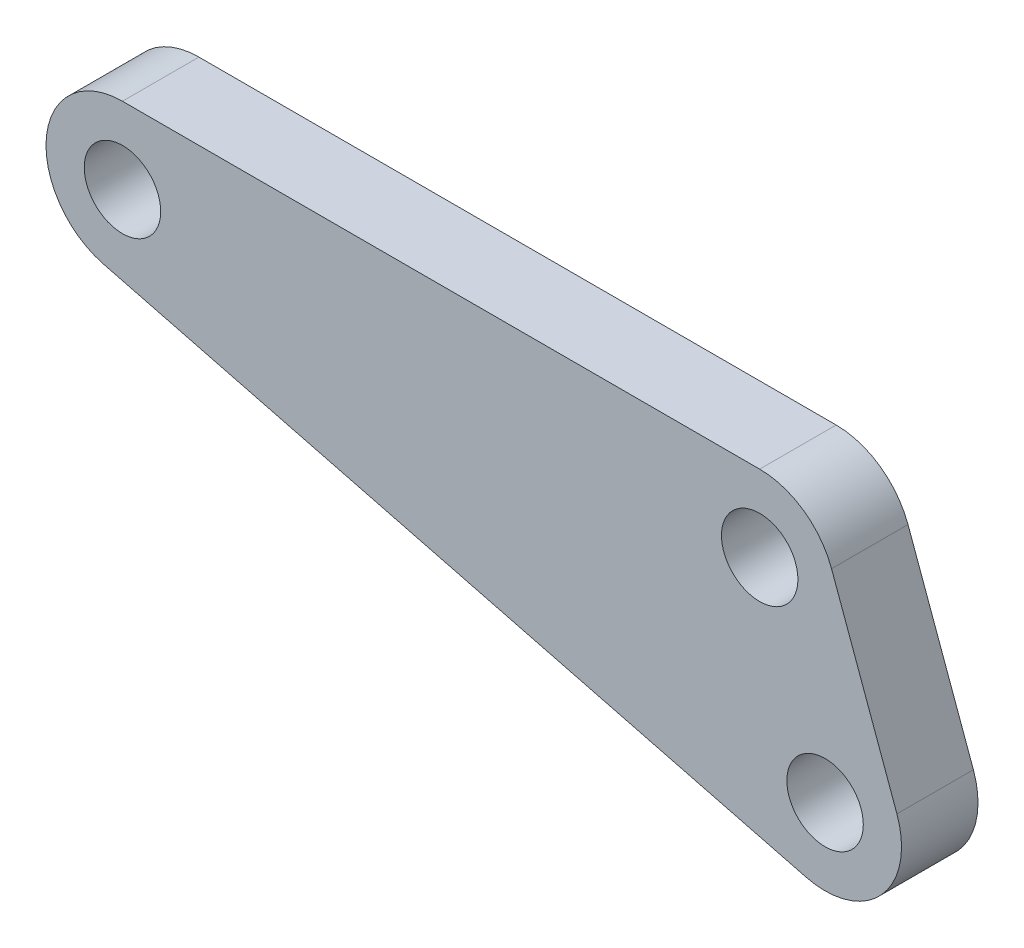
ISO-10303-21;
HEADER;
FILE_DESCRIPTION(('STEP AP214'),'2;1');
FILE_NAME('part.step','',(''),(''),'','','');
FILE_SCHEMA(('AUTOMOTIVE_DESIGN { 1 0 10303 214 1 1 1 1 }'));
ENDSEC;
DATA;
#1=APPLICATION_CONTEXT('core data for automotive mechanical design processes');
#2=APPLICATION_PROTOCOL_DEFINITION('international standard','automotive_design',2000,#1);
#3=PRODUCT_CONTEXT('',#1,'mechanical');
#4=PRODUCT('Part','Part','',(#3));
#5=PRODUCT_RELATED_PRODUCT_CATEGORY('part','',(#4));
#6=PRODUCT_DEFINITION_FORMATION('','',#4);
#7=PRODUCT_DEFINITION_CONTEXT('part definition',#1,'design');
#8=PRODUCT_DEFINITION('design','',#6,#7);
#9=PRODUCT_DEFINITION_SHAPE('','',#8);
#10=(LENGTH_UNIT() NAMED_UNIT(*) SI_UNIT(.MILLI.,.METRE.));
#11=(NAMED_UNIT(*) PLANE_ANGLE_UNIT() SI_UNIT($,.RADIAN.));
#12=(NAMED_UNIT(*) SI_UNIT($,.STERADIAN.) SOLID_ANGLE_UNIT());
#13=UNCERTAINTY_MEASURE_WITH_UNIT(LENGTH_MEASURE(1.E-05),#10,'distance_accuracy_value','');
#14=(GEOMETRIC_REPRESENTATION_CONTEXT(3) GLOBAL_UNCERTAINTY_ASSIGNED_CONTEXT((#13)) GLOBAL_UNIT_ASSIGNED_CONTEXT((#10,
#11,#12)) REPRESENTATION_CONTEXT('',''));
#15=CARTESIAN_POINT('',(0.,0.,0.));
#16=DIRECTION('',(0.,0.,1.));
#17=DIRECTION('',(1.,0.,0.));
#18=AXIS2_PLACEMENT_3D('',#15,#16,#17);
#19=CARTESIAN_POINT('',(0.,0.,3.));
#20=DIRECTION('',(0.,0.,1.));
#21=DIRECTION('',(1.,0.,0.));
#22=AXIS2_PLACEMENT_3D('',#19,#20,#21);
#23=PLANE('',#22);
#24=CARTESIAN_POINT('',(0.,0.,3.));
#25=DIRECTION('',(0.,0.,1.));
#26=DIRECTION('',(1.,0.,0.));
#27=AXIS2_PLACEMENT_3D('',#24,#25,#26);
#28=CIRCLE('',#27,1.5);
#29=CARTESIAN_POINT('',(1.5,0.,3.));
#30=VERTEX_POINT('',#29);
#31=EDGE_CURVE('E207',#30,#30,#28,.T.);
#32=ORIENTED_EDGE('',*,*,#31,.F.);
#33=EDGE_LOOP('',(#32));
#34=FACE_BOUND('',#33,.T.);
#35=CARTESIAN_POINT('',(0.,0.,3.));
#36=DIRECTION('',(0.,0.,1.));
#37=DIRECTION('',(1.,0.,0.));
#38=AXIS2_PLACEMENT_3D('',#35,#36,#37);
#39=CIRCLE('',#38,3.);
#40=CARTESIAN_POINT('',(2.81907786235772,1.02606042997702,3.));
#41=VERTEX_POINT('',#40);
#42=CARTESIAN_POINT('',(0.,3.,3.));
#43=VERTEX_POINT('',#42);
#44=EDGE_CURVE('E146',#41,#43,#39,.T.);
#45=ORIENTED_EDGE('',*,*,#44,.T.);
#46=DIRECTION('',(-1.,0.,0.));
#47=VECTOR('',#46,1.);
#48=CARTESIAN_POINT('',(-25.,3.,3.));
#49=LINE('',#48,#47);
#50=CARTESIAN_POINT('',(-25.,3.,3.));
#51=VERTEX_POINT('',#50);
#52=EDGE_CURVE('E94',#43,#51,#49,.T.);
#53=ORIENTED_EDGE('',*,*,#52,.T.);
#54=CARTESIAN_POINT('',(-25.,0.,3.));
#55=DIRECTION('',(0.,0.,1.));
#56=DIRECTION('',(1.,0.,0.));
#57=AXIS2_PLACEMENT_3D('',#54,#55,#56);
#58=CIRCLE('',#57,3.);
#59=CARTESIAN_POINT('',(-25.7431181723219,-2.90650569962713,3.));
#60=VERTEX_POINT('',#59);
#61=EDGE_CURVE('E107',#51,#60,#58,.T.);
#62=ORIENTED_EDGE('',*,*,#61,.T.);
#63=DIRECTION('',(0.968835233209041,-0.247706057440634,0.));
#64=VECTOR('',#63,1.);
#65=CARTESIAN_POINT('',(1.82203290262064,-9.95420035552143,3.));
#66=LINE('',#65,#64);
#67=CARTESIAN_POINT('',(1.82203290262064,-9.95420035552143,3.));
#68=VERTEX_POINT('',#67);
#69=EDGE_CURVE('E101',#60,#68,#66,.T.);
#70=ORIENTED_EDGE('',*,*,#69,.T.);
#71=CARTESIAN_POINT('',(2.56515107494255,-7.0476946558943,3.));
#72=DIRECTION('',(0.,0.,1.));
#73=DIRECTION('',(1.,0.,0.));
#74=AXIS2_PLACEMENT_3D('',#71,#72,#73);
#75=CIRCLE('',#74,3.);
#76=CARTESIAN_POINT('',(5.38422893730027,-6.02163422591728,3.));
#77=VERTEX_POINT('',#76);
#78=EDGE_CURVE('E105',#68,#77,#75,.T.);
#79=ORIENTED_EDGE('',*,*,#78,.T.);
#80=DIRECTION('',(-0.342020143325673,0.939692620785907,0.));
#81=VECTOR('',#80,1.);
#82=CARTESIAN_POINT('',(2.81907786235772,1.02606042997702,3.));
#83=LINE('',#82,#81);
#84=EDGE_CURVE('E57',#77,#41,#83,.T.);
#85=ORIENTED_EDGE('',*,*,#84,.T.);
#86=EDGE_LOOP('',(#45,#53,#62,#70,#79,#85));
#87=FACE_BOUND('',#86,.T.);
#88=CARTESIAN_POINT('',(-25.,0.,3.));
#89=DIRECTION('',(0.,0.,1.));
#90=DIRECTION('',(1.,0.,0.));
#91=AXIS2_PLACEMENT_3D('',#88,#89,#90);
#92=CIRCLE('',#91,1.5);
#93=CARTESIAN_POINT('',(-23.5,0.,3.));
#94=VERTEX_POINT('',#93);
#95=EDGE_CURVE('E134',#94,#94,#92,.T.);
#96=ORIENTED_EDGE('',*,*,#95,.F.);
#97=EDGE_LOOP('',(#96));
#98=FACE_BOUND('',#97,.T.);
#99=CARTESIAN_POINT('',(2.56515107494255,-7.0476946558943,3.));
#100=DIRECTION('',(0.,0.,1.));
#101=DIRECTION('',(1.,0.,0.));
#102=AXIS2_PLACEMENT_3D('',#99,#100,#101);
#103=CIRCLE('',#102,1.5);
#104=CARTESIAN_POINT('',(4.06515107494254,-7.0476946558943,3.));
#105=VERTEX_POINT('',#104);
#106=EDGE_CURVE('E196',#105,#105,#103,.T.);
#107=ORIENTED_EDGE('',*,*,#106,.F.);
#108=EDGE_LOOP('',(#107));
#109=FACE_BOUND('',#108,.T.);
#110=ADVANCED_FACE('F39',(#34,#87,#98,#109),#23,.T.);
#111=CARTESIAN_POINT('',(0.,0.,0.));
#112=DIRECTION('',(0.,0.,1.));
#113=DIRECTION('',(1.,0.,0.));
#114=AXIS2_PLACEMENT_3D('',#111,#112,#113);
#115=PLANE('',#114);
#116=CARTESIAN_POINT('',(0.,0.,0.));
#117=DIRECTION('',(0.,0.,1.));
#118=DIRECTION('',(1.,0.,0.));
#119=AXIS2_PLACEMENT_3D('',#116,#117,#118);
#120=CIRCLE('',#119,3.);
#121=CARTESIAN_POINT('',(2.81907786235772,1.02606042997702,0.));
#122=VERTEX_POINT('',#121);
#123=CARTESIAN_POINT('',(0.,3.,0.));
#124=VERTEX_POINT('',#123);
#125=EDGE_CURVE('E129',#122,#124,#120,.T.);
#126=ORIENTED_EDGE('',*,*,#125,.F.);
#127=DIRECTION('',(-0.342020143325673,0.939692620785907,0.));
#128=VECTOR('',#127,1.);
#129=CARTESIAN_POINT('',(2.81907786235772,1.02606042997702,0.));
#130=LINE('',#129,#128);
#131=CARTESIAN_POINT('',(5.38422893730027,-6.02163422591728,0.));
#132=VERTEX_POINT('',#131);
#133=EDGE_CURVE('E86',#132,#122,#130,.T.);
#134=ORIENTED_EDGE('',*,*,#133,.F.);
#135=CARTESIAN_POINT('',(2.56515107494255,-7.0476946558943,0.));
#136=DIRECTION('',(0.,0.,1.));
#137=DIRECTION('',(1.,0.,0.));
#138=AXIS2_PLACEMENT_3D('',#135,#136,#137);
#139=CIRCLE('',#138,3.);
#140=CARTESIAN_POINT('',(1.82203290262064,-9.95420035552143,0.));
#141=VERTEX_POINT('',#140);
#142=EDGE_CURVE('E80',#141,#132,#139,.T.);
#143=ORIENTED_EDGE('',*,*,#142,.F.);
#144=DIRECTION('',(0.968835233209041,-0.247706057440634,0.));
#145=VECTOR('',#144,1.);
#146=CARTESIAN_POINT('',(1.82203290262064,-9.95420035552143,0.));
#147=LINE('',#146,#145);
#148=CARTESIAN_POINT('',(-25.7431181723219,-2.90650569962713,0.));
#149=VERTEX_POINT('',#148);
#150=EDGE_CURVE('E116',#149,#141,#147,.T.);
#151=ORIENTED_EDGE('',*,*,#150,.F.);
#152=CARTESIAN_POINT('',(-25.,0.,0.));
#153=DIRECTION('',(0.,0.,1.));
#154=DIRECTION('',(1.,0.,0.));
#155=AXIS2_PLACEMENT_3D('',#152,#153,#154);
#156=CIRCLE('',#155,3.);
#157=CARTESIAN_POINT('',(-25.,3.,0.));
#158=VERTEX_POINT('',#157);
#159=EDGE_CURVE('E137',#158,#149,#156,.T.);
#160=ORIENTED_EDGE('',*,*,#159,.F.);
#161=DIRECTION('',(-1.,0.,0.));
#162=VECTOR('',#161,1.);
#163=CARTESIAN_POINT('',(-25.,3.,0.));
#164=LINE('',#163,#162);
#165=EDGE_CURVE('E133',#124,#158,#164,.T.);
#166=ORIENTED_EDGE('',*,*,#165,.F.);
#167=EDGE_LOOP('',(#126,#134,#143,#151,#160,#166));
#168=FACE_BOUND('',#167,.T.);
#169=CARTESIAN_POINT('',(-25.,0.,0.));
#170=DIRECTION('',(0.,0.,1.));
#171=DIRECTION('',(1.,0.,0.));
#172=AXIS2_PLACEMENT_3D('',#169,#170,#171);
#173=CIRCLE('',#172,1.5);
#174=CARTESIAN_POINT('',(-23.5,0.,0.));
#175=VERTEX_POINT('',#174);
#176=EDGE_CURVE('E211',#175,#175,#173,.T.);
#177=ORIENTED_EDGE('',*,*,#176,.T.);
#178=EDGE_LOOP('',(#177));
#179=FACE_BOUND('',#178,.T.);
#180=CARTESIAN_POINT('',(0.,0.,0.));
#181=DIRECTION('',(0.,0.,1.));
#182=DIRECTION('',(1.,0.,0.));
#183=AXIS2_PLACEMENT_3D('',#180,#181,#182);
#184=CIRCLE('',#183,1.5);
#185=CARTESIAN_POINT('',(1.5,0.,0.));
#186=VERTEX_POINT('',#185);
#187=EDGE_CURVE('E204',#186,#186,#184,.T.);
#188=ORIENTED_EDGE('',*,*,#187,.T.);
#189=EDGE_LOOP('',(#188));
#190=FACE_BOUND('',#189,.T.);
#191=CARTESIAN_POINT('',(2.56515107494255,-7.0476946558943,0.));
#192=DIRECTION('',(0.,0.,1.));
#193=DIRECTION('',(1.,0.,0.));
#194=AXIS2_PLACEMENT_3D('',#191,#192,#193);
#195=CIRCLE('',#194,1.5);
#196=CARTESIAN_POINT('',(4.06515107494254,-7.0476946558943,0.));
#197=VERTEX_POINT('',#196);
#198=EDGE_CURVE('E199',#197,#197,#195,.T.);
#199=ORIENTED_EDGE('',*,*,#198,.T.);
#200=EDGE_LOOP('',(#199));
#201=FACE_BOUND('',#200,.T.);
#202=ADVANCED_FACE('F159',(#168,#179,#190,#201),#115,.F.);
#203=CARTESIAN_POINT('',(0.,0.,3.));
#204=DIRECTION('',(0.,0.,-1.));
#205=DIRECTION('',(-1.,0.,0.));
#206=AXIS2_PLACEMENT_3D('',#203,#204,#205);
#207=CYLINDRICAL_SURFACE('',#206,3.);
#208=ORIENTED_EDGE('',*,*,#125,.T.);
#209=DIRECTION('',(0.,0.,-1.));
#210=VECTOR('',#209,1.);
#211=CARTESIAN_POINT('',(0.,3.,3.));
#212=LINE('',#211,#210);
#213=EDGE_CURVE('E11',#43,#124,#212,.T.);
#214=ORIENTED_EDGE('',*,*,#213,.F.);
#215=ORIENTED_EDGE('',*,*,#44,.F.);
#216=DIRECTION('',(0.,0.,-1.));
#217=VECTOR('',#216,1.);
#218=CARTESIAN_POINT('',(2.81907786235772,1.02606042997702,3.));
#219=LINE('',#218,#217);
#220=EDGE_CURVE('E125',#41,#122,#219,.T.);
#221=ORIENTED_EDGE('',*,*,#220,.T.);
#222=EDGE_LOOP('',(#208,#214,#215,#221));
#223=FACE_BOUND('',#222,.T.);
#224=ADVANCED_FACE('F41',(#223),#207,.T.);
#225=CARTESIAN_POINT('',(-25.,3.,3.));
#226=DIRECTION('',(0.,-1.,0.));
#227=DIRECTION('',(1.,0.,0.));
#228=AXIS2_PLACEMENT_3D('',#225,#226,#227);
#229=PLANE('',#228);
#230=ORIENTED_EDGE('',*,*,#165,.T.);
#231=DIRECTION('',(0.,0.,-1.));
#232=VECTOR('',#231,1.);
#233=CARTESIAN_POINT('',(-25.,3.,3.));
#234=LINE('',#233,#232);
#235=EDGE_CURVE('E49',#51,#158,#234,.T.);
#236=ORIENTED_EDGE('',*,*,#235,.F.);
#237=ORIENTED_EDGE('',*,*,#52,.F.);
#238=ORIENTED_EDGE('',*,*,#213,.T.);
#239=EDGE_LOOP('',(#230,#236,#237,#238));
#240=FACE_BOUND('',#239,.T.);
#241=ADVANCED_FACE('F267',(#240),#229,.F.);
#242=CARTESIAN_POINT('',(-25.,0.,3.));
#243=DIRECTION('',(0.,0.,-1.));
#244=DIRECTION('',(-1.,0.,0.));
#245=AXIS2_PLACEMENT_3D('',#242,#243,#244);
#246=CYLINDRICAL_SURFACE('',#245,3.);
#247=ORIENTED_EDGE('',*,*,#159,.T.);
#248=DIRECTION('',(0.,0.,-1.));
#249=VECTOR('',#248,1.);
#250=CARTESIAN_POINT('',(-25.7431181723219,-2.90650569962713,3.));
#251=LINE('',#250,#249);
#252=EDGE_CURVE('E118',#60,#149,#251,.T.);
#253=ORIENTED_EDGE('',*,*,#252,.F.);
#254=ORIENTED_EDGE('',*,*,#61,.F.);
#255=ORIENTED_EDGE('',*,*,#235,.T.);
#256=EDGE_LOOP('',(#247,#253,#254,#255));
#257=FACE_BOUND('',#256,.T.);
#258=ADVANCED_FACE('F156',(#257),#246,.T.);
#259=CARTESIAN_POINT('',(1.82203290262064,-9.95420035552143,3.));
#260=DIRECTION('',(0.247706057440634,0.968835233209041,0.));
#261=DIRECTION('',(-0.968835233209041,0.247706057440634,0.));
#262=AXIS2_PLACEMENT_3D('',#259,#260,#261);
#263=PLANE('',#262);
#264=ORIENTED_EDGE('',*,*,#150,.T.);
#265=DIRECTION('',(0.,0.,-1.));
#266=VECTOR('',#265,1.);
#267=CARTESIAN_POINT('',(1.82203290262064,-9.95420035552143,3.));
#268=LINE('',#267,#266);
#269=EDGE_CURVE('E113',#68,#141,#268,.T.);
#270=ORIENTED_EDGE('',*,*,#269,.F.);
#271=ORIENTED_EDGE('',*,*,#69,.F.);
#272=ORIENTED_EDGE('',*,*,#252,.T.);
#273=EDGE_LOOP('',(#264,#270,#271,#272));
#274=FACE_BOUND('',#273,.T.);
#275=ADVANCED_FACE('F114',(#274),#263,.F.);
#276=CARTESIAN_POINT('',(2.56515107494255,-7.0476946558943,3.));
#277=DIRECTION('',(0.,0.,-1.));
#278=DIRECTION('',(-1.,0.,0.));
#279=AXIS2_PLACEMENT_3D('',#276,#277,#278);
#280=CYLINDRICAL_SURFACE('',#279,3.);
#281=ORIENTED_EDGE('',*,*,#142,.T.);
#282=DIRECTION('',(0.,0.,-1.));
#283=VECTOR('',#282,1.);
#284=CARTESIAN_POINT('',(5.38422893730027,-6.02163422591728,3.));
#285=LINE('',#284,#283);
#286=EDGE_CURVE('E119',#77,#132,#285,.T.);
#287=ORIENTED_EDGE('',*,*,#286,.F.);
#288=ORIENTED_EDGE('',*,*,#78,.F.);
#289=ORIENTED_EDGE('',*,*,#269,.T.);
#290=EDGE_LOOP('',(#281,#287,#288,#289));
#291=FACE_BOUND('',#290,.T.);
#292=ADVANCED_FACE('F121',(#291),#280,.T.);
#293=CARTESIAN_POINT('',(2.81907786235772,1.02606042997702,3.));
#294=DIRECTION('',(-0.939692620785907,-0.342020143325673,0.));
#295=DIRECTION('',(0.342020143325673,-0.939692620785907,0.));
#296=AXIS2_PLACEMENT_3D('',#293,#294,#295);
#297=PLANE('',#296);
#298=ORIENTED_EDGE('',*,*,#133,.T.);
#299=ORIENTED_EDGE('',*,*,#220,.F.);
#300=ORIENTED_EDGE('',*,*,#84,.F.);
#301=ORIENTED_EDGE('',*,*,#286,.T.);
#302=EDGE_LOOP('',(#298,#299,#300,#301));
#303=FACE_BOUND('',#302,.T.);
#304=ADVANCED_FACE('F164',(#303),#297,.F.);
#305=CARTESIAN_POINT('',(-25.,0.,3.));
#306=DIRECTION('',(0.,0.,-1.));
#307=DIRECTION('',(-1.,0.,0.));
#308=AXIS2_PLACEMENT_3D('',#305,#306,#307);
#309=CYLINDRICAL_SURFACE('',#308,1.5);
#310=ORIENTED_EDGE('',*,*,#95,.T.);
#311=EDGE_LOOP('',(#310));
#312=FACE_BOUND('',#311,.T.);
#313=ORIENTED_EDGE('',*,*,#176,.F.);
#314=EDGE_LOOP('',(#313));
#315=FACE_BOUND('',#314,.T.);
#316=ADVANCED_FACE('F166',(#312,#315),#309,.F.);
#317=CARTESIAN_POINT('',(0.,0.,3.));
#318=DIRECTION('',(0.,0.,-1.));
#319=DIRECTION('',(-1.,0.,0.));
#320=AXIS2_PLACEMENT_3D('',#317,#318,#319);
#321=CYLINDRICAL_SURFACE('',#320,1.5);
#322=ORIENTED_EDGE('',*,*,#31,.T.);
#323=EDGE_LOOP('',(#322));
#324=FACE_BOUND('',#323,.T.);
#325=ORIENTED_EDGE('',*,*,#187,.F.);
#326=EDGE_LOOP('',(#325));
#327=FACE_BOUND('',#326,.T.);
#328=ADVANCED_FACE('F172',(#324,#327),#321,.F.);
#329=CARTESIAN_POINT('',(2.56515107494255,-7.0476946558943,3.));
#330=DIRECTION('',(0.,0.,-1.));
#331=DIRECTION('',(-1.,0.,0.));
#332=AXIS2_PLACEMENT_3D('',#329,#330,#331);
#333=CYLINDRICAL_SURFACE('',#332,1.5);
#334=ORIENTED_EDGE('',*,*,#106,.T.);
#335=EDGE_LOOP('',(#334));
#336=FACE_BOUND('',#335,.T.);
#337=ORIENTED_EDGE('',*,*,#198,.F.);
#338=EDGE_LOOP('',(#337));
#339=FACE_BOUND('',#338,.T.);
#340=ADVANCED_FACE('F187',(#336,#339),#333,.F.);
#341=CLOSED_SHELL('',(#110,#202,#224,#241,#258,#275,#292,#304,#316,#328,#340));
#342=MANIFOLD_SOLID_BREP('B2',#341);
#343=ADVANCED_BREP_SHAPE_REPRESENTATION('',(#18,#342),#14);
#344=SHAPE_DEFINITION_REPRESENTATION(#9,#343);
ENDSEC;
END-ISO-10303-21;
